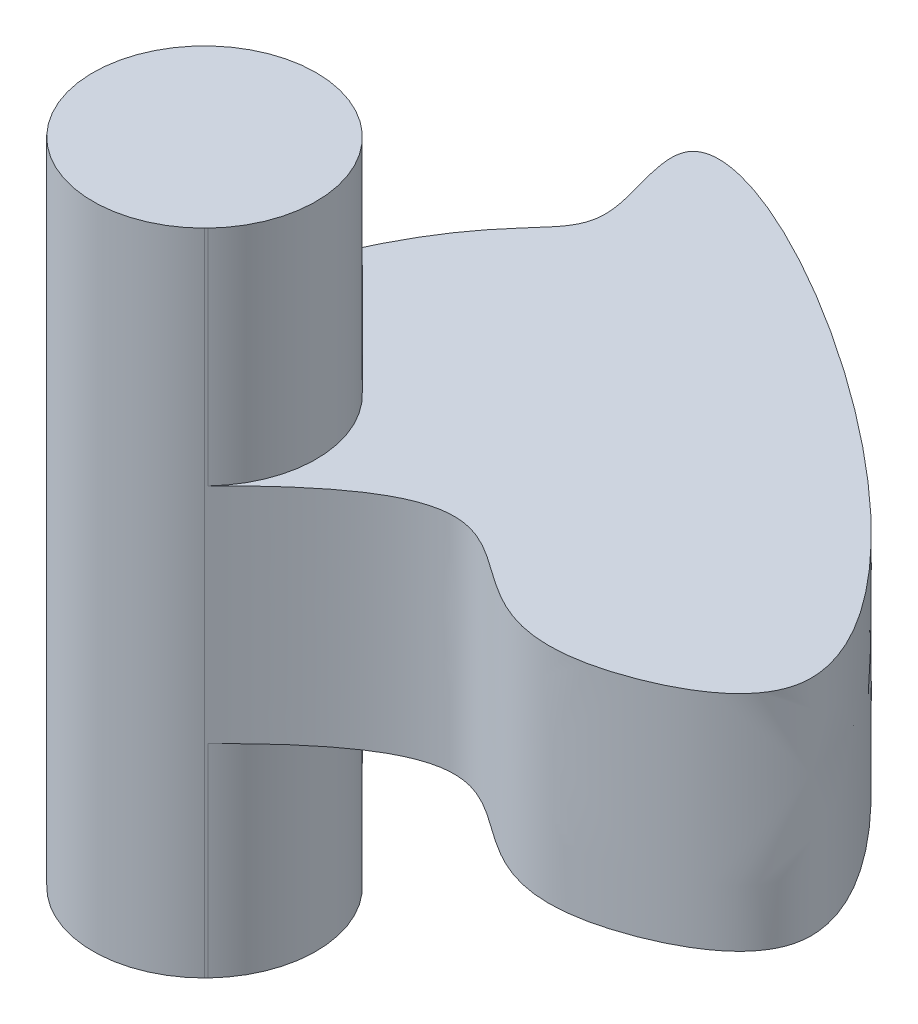
ISO-10303-21;
HEADER;
FILE_DESCRIPTION(('STEP AP214'),'2;1');
FILE_NAME('part.step','',(''),(''),'','','');
FILE_SCHEMA(('AUTOMOTIVE_DESIGN { 1 0 10303 214 1 1 1 1 }'));
ENDSEC;
DATA;
#1=APPLICATION_CONTEXT('core data for automotive mechanical design processes');
#2=APPLICATION_PROTOCOL_DEFINITION('international standard','automotive_design',2000,#1);
#3=PRODUCT_CONTEXT('',#1,'mechanical');
#4=PRODUCT('Part','Part','',(#3));
#5=PRODUCT_RELATED_PRODUCT_CATEGORY('part','',(#4));
#6=PRODUCT_DEFINITION_FORMATION('','',#4);
#7=PRODUCT_DEFINITION_CONTEXT('part definition',#1,'design');
#8=PRODUCT_DEFINITION('design','',#6,#7);
#9=PRODUCT_DEFINITION_SHAPE('','',#8);
#10=(LENGTH_UNIT() NAMED_UNIT(*) SI_UNIT(.MILLI.,.METRE.));
#11=(NAMED_UNIT(*) PLANE_ANGLE_UNIT() SI_UNIT($,.RADIAN.));
#12=(NAMED_UNIT(*) SI_UNIT($,.STERADIAN.) SOLID_ANGLE_UNIT());
#13=UNCERTAINTY_MEASURE_WITH_UNIT(LENGTH_MEASURE(1.E-05),#10,'distance_accuracy_value','');
#14=(GEOMETRIC_REPRESENTATION_CONTEXT(3) GLOBAL_UNCERTAINTY_ASSIGNED_CONTEXT((#13)) GLOBAL_UNIT_ASSIGNED_CONTEXT((#10,
#11,#12)) REPRESENTATION_CONTEXT('',''));
#15=CARTESIAN_POINT('',(0.,0.,0.));
#16=DIRECTION('',(0.,0.,1.));
#17=DIRECTION('',(1.,0.,0.));
#18=AXIS2_PLACEMENT_3D('',#15,#16,#17);
#19=CARTESIAN_POINT('',(-1.06251840891798,2.2,-0.284700949612773));
#20=CARTESIAN_POINT('',(-0.305026322444171,2.2,-3.43172095820594));
#21=CARTESIAN_POINT('',(0.846331830767659,2.2,-2.7008905109231));
#22=CARTESIAN_POINT('',(-0.378004134822085,2.2,-5.83668564438333));
#23=CARTESIAN_POINT('',(7.05503628663602,2.2,-0.982770030149305));
#24=CARTESIAN_POINT('',(2.45288071352752,2.2,1.47458674602472));
#25=CARTESIAN_POINT('',(2.96901689410161,2.2,-1.47114053814325));
#26=CARTESIAN_POINT('',(0.777817459305116,2.2,0.77781745930529));
#27=B_SPLINE_CURVE_WITH_KNOTS('',3,(#19,#20,#21,#22,#23,#24,#25,#26),.UNSPECIFIED.,.F.,.F.,(4,1,
1,1,1,4),(0.,0.225062079478628,0.283845431745352,0.554057068120364,0.629050170400516,1.),.UNSPECIFIED.);
#28=DIRECTION('',(0.,-1.,0.));
#29=VECTOR('',#28,1.);
#30=SURFACE_OF_LINEAR_EXTRUSION('',#27,#29);
#31=CARTESIAN_POINT('',(-1.06251840891798,2.2,-0.284700949612773));
#32=VERTEX_POINT('',#31);
#33=CARTESIAN_POINT('',(0.795910056608666,2.2,0.759293870506795));
#34=VERTEX_POINT('',#33);
#35=EDGE_CURVE('E78',#32,#34,#27,.T.);
#36=ORIENTED_EDGE('',*,*,#35,.T.);
#37=DIRECTION('',(0.,1.,0.));
#38=VECTOR('',#37,1.);
#39=CARTESIAN_POINT('',(0.795910056608667,-2.,0.759293870506795));
#40=LINE('',#39,#38);
#41=CARTESIAN_POINT('',(0.795910056608667,4.4,0.759293870506795));
#42=VERTEX_POINT('',#41);
#43=EDGE_CURVE('E74',#34,#42,#40,.T.);
#44=ORIENTED_EDGE('',*,*,#43,.T.);
#45=CARTESIAN_POINT('',(-1.06251840891798,4.4,-0.284700949612773));
#46=CARTESIAN_POINT('',(-0.305026322444171,4.4,-3.43172095820594));
#47=CARTESIAN_POINT('',(0.846331830767659,4.4,-2.7008905109231));
#48=CARTESIAN_POINT('',(-0.378004134822085,4.4,-5.83668564438333));
#49=CARTESIAN_POINT('',(7.05503628663602,4.4,-0.982770030149305));
#50=CARTESIAN_POINT('',(2.45288071352752,4.4,1.47458674602472));
#51=CARTESIAN_POINT('',(2.96901689410161,4.4,-1.47114053814325));
#52=CARTESIAN_POINT('',(0.777817459305116,4.4,0.77781745930529));
#53=B_SPLINE_CURVE_WITH_KNOTS('',3,(#45,#46,#47,#48,#49,#50,#51,#52),.UNSPECIFIED.,.F.,.F.,(4,1,
1,1,1,4),(0.,0.225062079478628,0.283845431745352,0.554057068120364,0.629050170400516,1.),.UNSPECIFIED.);
#54=CARTESIAN_POINT('',(0.777817459305116,4.4,0.777817459305289));
#55=VERTEX_POINT('',#54);
#56=EDGE_CURVE('E77',#42,#55,#53,.T.);
#57=ORIENTED_EDGE('',*,*,#56,.T.);
#58=DIRECTION('',(0.,-1.,0.));
#59=VECTOR('',#58,1.);
#60=CARTESIAN_POINT('',(0.777817459305116,2.2,0.777817459305289));
#61=LINE('',#60,#59);
#62=CARTESIAN_POINT('',(0.777817459305116,-2.,0.777817459305289));
#63=VERTEX_POINT('',#62);
#64=EDGE_CURVE('E87',#55,#63,#61,.T.);
#65=ORIENTED_EDGE('',*,*,#64,.T.);
#66=CARTESIAN_POINT('',(-1.06251840891798,-2.,-0.284700949612773));
#67=CARTESIAN_POINT('',(-0.305026322444171,-2.,-3.43172095820594));
#68=CARTESIAN_POINT('',(0.846331830767659,-2.,-2.7008905109231));
#69=CARTESIAN_POINT('',(-0.378004134822085,-2.,-5.83668564438333));
#70=CARTESIAN_POINT('',(7.05503628663602,-2.,-0.982770030149305));
#71=CARTESIAN_POINT('',(2.45288071352752,-2.,1.47458674602472));
#72=CARTESIAN_POINT('',(2.96901689410161,-2.,-1.47114053814325));
#73=CARTESIAN_POINT('',(0.777817459305116,-2.,0.77781745930529));
#74=B_SPLINE_CURVE_WITH_KNOTS('',3,(#66,#67,#68,#69,#70,#71,#72,#73),.UNSPECIFIED.,.F.,.F.,(4,1,
1,1,1,4),(0.,0.225062079478628,0.283845431745352,0.554057068120364,0.629050170400516,1.),.UNSPECIFIED.);
#75=CARTESIAN_POINT('',(0.795910056608667,-2.,0.759293870506795));
#76=VERTEX_POINT('',#75);
#77=EDGE_CURVE('E89',#76,#63,#74,.T.);
#78=ORIENTED_EDGE('',*,*,#77,.F.);
#79=CARTESIAN_POINT('',(0.795910056608667,0.,0.759293870506795));
#80=VERTEX_POINT('',#79);
#81=EDGE_CURVE('E80',#76,#80,#40,.T.);
#82=ORIENTED_EDGE('',*,*,#81,.T.);
#83=CARTESIAN_POINT('',(-1.06251840891798,0.,-0.284700949612773));
#84=CARTESIAN_POINT('',(-0.305026322444171,0.,-3.43172095820594));
#85=CARTESIAN_POINT('',(0.846331830767659,0.,-2.7008905109231));
#86=CARTESIAN_POINT('',(-0.378004134822085,0.,-5.83668564438333));
#87=CARTESIAN_POINT('',(7.05503628663602,0.,-0.982770030149305));
#88=CARTESIAN_POINT('',(2.45288071352752,0.,1.47458674602472));
#89=CARTESIAN_POINT('',(2.96901689410161,0.,-1.47114053814325));
#90=CARTESIAN_POINT('',(0.777817459305116,0.,0.77781745930529));
#91=B_SPLINE_CURVE_WITH_KNOTS('',3,(#83,#84,#85,#86,#87,#88,#89,#90),.UNSPECIFIED.,.F.,.F.,(4,1,
1,1,1,4),(0.,0.225062079478628,0.283845431745352,0.554057068120364,0.629050170400516,1.),.UNSPECIFIED.);
#92=CARTESIAN_POINT('',(-1.06251840891798,0.,-0.284700949612773));
#93=VERTEX_POINT('',#92);
#94=EDGE_CURVE('E108',#93,#80,#91,.T.);
#95=ORIENTED_EDGE('',*,*,#94,.F.);
#96=DIRECTION('',(0.,-1.,0.));
#97=VECTOR('',#96,1.);
#98=CARTESIAN_POINT('',(-1.06251840891798,2.2,-0.284700949612773));
#99=LINE('',#98,#97);
#100=EDGE_CURVE('E43',#32,#93,#99,.T.);
#101=ORIENTED_EDGE('',*,*,#100,.F.);
#102=EDGE_LOOP('',(#36,#44,#57,#65,#78,#82,#95,#101));
#103=FACE_BOUND('',#102,.T.);
#104=ADVANCED_FACE('F35',(#103),#30,.T.);
#105=CARTESIAN_POINT('',(0.,2.2,0.));
#106=DIRECTION('',(0.,-1.,0.));
#107=DIRECTION('',(0.,0.,-1.));
#108=AXIS2_PLACEMENT_3D('',#105,#106,#107);
#109=CYLINDRICAL_SURFACE('',#108,1.1);
#110=ORIENTED_EDGE('',*,*,#100,.T.);
#111=CARTESIAN_POINT('',(0.,0.,0.));
#112=DIRECTION('',(0.,1.,0.));
#113=DIRECTION('',(0.,0.,1.));
#114=AXIS2_PLACEMENT_3D('',#111,#112,#113);
#115=CIRCLE('',#114,1.1);
#116=EDGE_CURVE('E11',#80,#93,#115,.T.);
#117=ORIENTED_EDGE('',*,*,#116,.F.);
#118=ORIENTED_EDGE('',*,*,#81,.F.);
#119=CARTESIAN_POINT('',(0.,-2.,0.));
#120=DIRECTION('',(0.,1.,0.));
#121=DIRECTION('',(0.,0.,1.));
#122=AXIS2_PLACEMENT_3D('',#119,#120,#121);
#123=CIRCLE('',#122,1.1);
#124=EDGE_CURVE('E81',#76,#63,#123,.T.);
#125=ORIENTED_EDGE('',*,*,#124,.T.);
#126=ORIENTED_EDGE('',*,*,#64,.F.);
#127=CARTESIAN_POINT('',(0.,4.4,0.));
#128=DIRECTION('',(0.,1.,0.));
#129=DIRECTION('',(0.,0.,1.));
#130=AXIS2_PLACEMENT_3D('',#127,#128,#129);
#131=CIRCLE('',#130,1.1);
#132=EDGE_CURVE('E84',#42,#55,#131,.T.);
#133=ORIENTED_EDGE('',*,*,#132,.F.);
#134=ORIENTED_EDGE('',*,*,#43,.F.);
#135=CARTESIAN_POINT('',(0.,2.2,0.));
#136=DIRECTION('',(0.,1.,0.));
#137=DIRECTION('',(0.,0.,1.));
#138=AXIS2_PLACEMENT_3D('',#135,#136,#137);
#139=CIRCLE('',#138,1.1);
#140=EDGE_CURVE('E49',#34,#32,#139,.T.);
#141=ORIENTED_EDGE('',*,*,#140,.T.);
#142=EDGE_LOOP('',(#110,#117,#118,#125,#126,#133,#134,#141));
#143=FACE_BOUND('',#142,.T.);
#144=ADVANCED_FACE('F85',(#143),#109,.T.);
#145=CARTESIAN_POINT('',(0.,2.2,0.));
#146=DIRECTION('',(0.,1.,0.));
#147=DIRECTION('',(0.,0.,1.));
#148=AXIS2_PLACEMENT_3D('',#145,#146,#147);
#149=PLANE('',#148);
#150=ORIENTED_EDGE('',*,*,#140,.F.);
#151=ORIENTED_EDGE('',*,*,#35,.F.);
#152=EDGE_LOOP('',(#150,#151));
#153=FACE_BOUND('',#152,.T.);
#154=ADVANCED_FACE('F128',(#153),#149,.T.);
#155=CARTESIAN_POINT('',(0.,0.,0.));
#156=DIRECTION('',(0.,1.,0.));
#157=DIRECTION('',(0.,0.,1.));
#158=AXIS2_PLACEMENT_3D('',#155,#156,#157);
#159=PLANE('',#158);
#160=ORIENTED_EDGE('',*,*,#94,.T.);
#161=ORIENTED_EDGE('',*,*,#116,.T.);
#162=EDGE_LOOP('',(#160,#161));
#163=FACE_BOUND('',#162,.T.);
#164=ADVANCED_FACE('F125',(#163),#159,.F.);
#165=CARTESIAN_POINT('',(0.,-2.,0.));
#166=DIRECTION('',(0.,1.,0.));
#167=DIRECTION('',(0.,0.,1.));
#168=AXIS2_PLACEMENT_3D('',#165,#166,#167);
#169=PLANE('',#168);
#170=ORIENTED_EDGE('',*,*,#77,.T.);
#171=ORIENTED_EDGE('',*,*,#124,.F.);
#172=EDGE_LOOP('',(#170,#171));
#173=FACE_BOUND('',#172,.T.);
#174=ADVANCED_FACE('F127',(#173),#169,.F.);
#175=CARTESIAN_POINT('',(0.,4.4,0.));
#176=DIRECTION('',(0.,1.,0.));
#177=DIRECTION('',(0.,0.,1.));
#178=AXIS2_PLACEMENT_3D('',#175,#176,#177);
#179=PLANE('',#178);
#180=ORIENTED_EDGE('',*,*,#56,.F.);
#181=ORIENTED_EDGE('',*,*,#132,.T.);
#182=EDGE_LOOP('',(#180,#181));
#183=FACE_BOUND('',#182,.T.);
#184=ADVANCED_FACE('F91',(#183),#179,.T.);
#185=CLOSED_SHELL('',(#104,#144,#154,#164,#174,#184));
#186=MANIFOLD_SOLID_BREP('B2',#185);
#187=ADVANCED_BREP_SHAPE_REPRESENTATION('',(#18,#186),#14);
#188=SHAPE_DEFINITION_REPRESENTATION(#9,#187);
ENDSEC;
END-ISO-10303-21;
